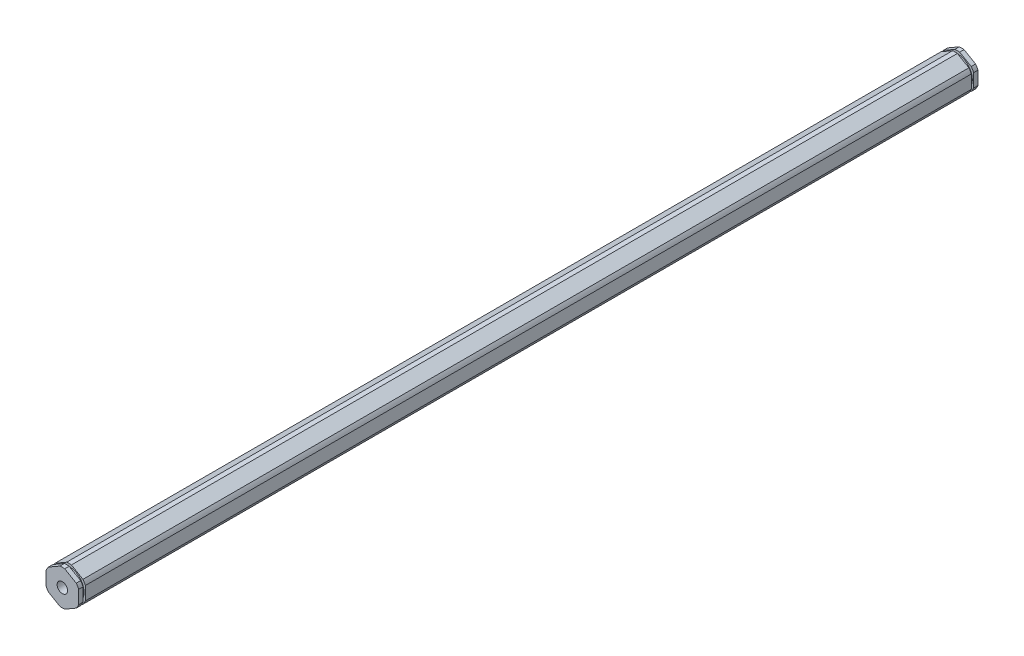
ISO-10303-21;
HEADER;
FILE_DESCRIPTION(('STEP AP214'),'2;1');
FILE_NAME('part.step','',(''),(''),'','','');
FILE_SCHEMA(('AUTOMOTIVE_DESIGN { 1 0 10303 214 1 1 1 1 }'));
ENDSEC;
DATA;
#1=APPLICATION_CONTEXT('core data for automotive mechanical design processes');
#2=APPLICATION_PROTOCOL_DEFINITION('international standard','automotive_design',2000,#1);
#3=PRODUCT_CONTEXT('',#1,'mechanical');
#4=PRODUCT('Part','Part','',(#3));
#5=PRODUCT_RELATED_PRODUCT_CATEGORY('part','',(#4));
#6=PRODUCT_DEFINITION_FORMATION('','',#4);
#7=PRODUCT_DEFINITION_CONTEXT('part definition',#1,'design');
#8=PRODUCT_DEFINITION('design','',#6,#7);
#9=PRODUCT_DEFINITION_SHAPE('','',#8);
#10=(LENGTH_UNIT() NAMED_UNIT(*) SI_UNIT(.MILLI.,.METRE.));
#11=(NAMED_UNIT(*) PLANE_ANGLE_UNIT() SI_UNIT($,.RADIAN.));
#12=(NAMED_UNIT(*) SI_UNIT($,.STERADIAN.) SOLID_ANGLE_UNIT());
#13=UNCERTAINTY_MEASURE_WITH_UNIT(LENGTH_MEASURE(1.E-05),#10,'distance_accuracy_value','');
#14=(GEOMETRIC_REPRESENTATION_CONTEXT(3) GLOBAL_UNCERTAINTY_ASSIGNED_CONTEXT((#13)) GLOBAL_UNIT_ASSIGNED_CONTEXT((#10,
#11,#12)) REPRESENTATION_CONTEXT('',''));
#15=CARTESIAN_POINT('',(0.,0.,0.));
#16=DIRECTION('',(0.,0.,1.));
#17=DIRECTION('',(1.,0.,0.));
#18=AXIS2_PLACEMENT_3D('',#15,#16,#17);
#19=CARTESIAN_POINT('',(0.,0.,174.84725));
#20=DIRECTION('',(0.,0.,-1.));
#21=DIRECTION('',(-1.,0.,0.));
#22=AXIS2_PLACEMENT_3D('',#19,#20,#21);
#23=CYLINDRICAL_SURFACE('',#22,6.858);
#24=CARTESIAN_POINT('',(0.,0.,-172.24375));
#25=DIRECTION('',(0.,0.,1.));
#26=DIRECTION('',(1.,0.,0.));
#27=AXIS2_PLACEMENT_3D('',#24,#25,#26);
#28=CIRCLE('',#27,6.858);
#29=CARTESIAN_POINT('',(5.41826726004728,-4.20411035757861,-172.24375));
#30=VERTEX_POINT('',#29);
#31=CARTESIAN_POINT('',(6.35,-2.59030191290513,-172.24375));
#32=VERTEX_POINT('',#31);
#33=EDGE_CURVE('E308',#30,#32,#28,.T.);
#34=ORIENTED_EDGE('',*,*,#33,.T.);
#35=DIRECTION('',(0.,0.,-1.));
#36=VECTOR('',#35,1.);
#37=CARTESIAN_POINT('',(6.35,-2.59030191290513,174.84725));
#38=LINE('',#37,#36);
#39=CARTESIAN_POINT('',(6.35,-2.59030191290513,172.24375));
#40=VERTEX_POINT('',#39);
#41=EDGE_CURVE('E354',#40,#32,#38,.T.);
#42=ORIENTED_EDGE('',*,*,#41,.F.);
#43=CARTESIAN_POINT('',(0.,0.,172.24375));
#44=DIRECTION('',(0.,0.,1.));
#45=DIRECTION('',(1.,0.,0.));
#46=AXIS2_PLACEMENT_3D('',#43,#44,#45);
#47=CIRCLE('',#46,6.858);
#48=CARTESIAN_POINT('',(5.41826726004727,-4.20411035757862,172.24375));
#49=VERTEX_POINT('',#48);
#50=EDGE_CURVE('E330',#49,#40,#47,.T.);
#51=ORIENTED_EDGE('',*,*,#50,.F.);
#52=DIRECTION('',(0.,0.,-1.));
#53=VECTOR('',#52,1.);
#54=CARTESIAN_POINT('',(5.41826726004727,-4.20411035757862,174.84725));
#55=LINE('',#54,#53);
#56=EDGE_CURVE('E356',#49,#30,#55,.T.);
#57=ORIENTED_EDGE('',*,*,#56,.T.);
#58=EDGE_LOOP('',(#34,#42,#51,#57));
#59=FACE_BOUND('',#58,.T.);
#60=ADVANCED_FACE('F57',(#59),#23,.T.);
#61=CARTESIAN_POINT('',(3.175,-5.49926131403118,174.84725));
#62=DIRECTION('',(-0.5,0.866025403784438,0.));
#63=DIRECTION('',(-0.866025403784439,-0.5,0.));
#64=AXIS2_PLACEMENT_3D('',#61,#62,#63);
#65=PLANE('',#64);
#66=DIRECTION('',(-0.866025403784439,-0.5,0.));
#67=VECTOR('',#66,1.);
#68=CARTESIAN_POINT('',(3.175,-5.49926131403118,-172.24375));
#69=LINE('',#68,#67);
#70=CARTESIAN_POINT('',(0.931732739952731,-6.79441227048375,-172.24375));
#71=VERTEX_POINT('',#70);
#72=EDGE_CURVE('E626',#30,#71,#69,.T.);
#73=ORIENTED_EDGE('',*,*,#72,.F.);
#74=ORIENTED_EDGE('',*,*,#56,.F.);
#75=DIRECTION('',(0.866025403784439,0.5,0.));
#76=VECTOR('',#75,1.);
#77=CARTESIAN_POINT('',(3.175,-5.49926131403118,172.24375));
#78=LINE('',#77,#76);
#79=CARTESIAN_POINT('',(0.931732739952722,-6.79441227048375,172.24375));
#80=VERTEX_POINT('',#79);
#81=EDGE_CURVE('E590',#80,#49,#78,.T.);
#82=ORIENTED_EDGE('',*,*,#81,.F.);
#83=DIRECTION('',(0.,0.,-1.));
#84=VECTOR('',#83,1.);
#85=CARTESIAN_POINT('',(0.931732739952731,-6.79441227048375,174.84725));
#86=LINE('',#85,#84);
#87=EDGE_CURVE('E386',#80,#71,#86,.T.);
#88=ORIENTED_EDGE('',*,*,#87,.T.);
#89=EDGE_LOOP('',(#73,#74,#82,#88));
#90=FACE_BOUND('',#89,.T.);
#91=ADVANCED_FACE('F689',(#90),#65,.F.);
#92=CARTESIAN_POINT('',(-0.931732739952717,-6.79441227048375,-172.24375));
#93=VERTEX_POINT('',#92);
#94=EDGE_CURVE('E358',#93,#71,#28,.T.);
#95=ORIENTED_EDGE('',*,*,#94,.T.);
#96=ORIENTED_EDGE('',*,*,#87,.F.);
#97=CARTESIAN_POINT('',(0.,0.,172.24375));
#98=DIRECTION('',(0.,0.,1.));
#99=DIRECTION('',(1.,0.,0.));
#100=AXIS2_PLACEMENT_3D('',#97,#98,#99);
#101=CIRCLE('',#100,6.858);
#102=CARTESIAN_POINT('',(-0.931732739952721,-6.79441227048375,172.24375));
#103=VERTEX_POINT('',#102);
#104=EDGE_CURVE('E605',#103,#80,#101,.T.);
#105=ORIENTED_EDGE('',*,*,#104,.F.);
#106=DIRECTION('',(0.,0.,-1.));
#107=VECTOR('',#106,1.);
#108=CARTESIAN_POINT('',(-0.931732739952721,-6.79441227048375,174.84725));
#109=LINE('',#108,#107);
#110=EDGE_CURVE('E392',#103,#93,#109,.T.);
#111=ORIENTED_EDGE('',*,*,#110,.T.);
#112=EDGE_LOOP('',(#95,#96,#105,#111));
#113=FACE_BOUND('',#112,.T.);
#114=ADVANCED_FACE('F683',(#113),#23,.T.);
#115=CARTESIAN_POINT('',(-3.175,-5.49926131403118,174.84725));
#116=DIRECTION('',(0.5,0.866025403784439,0.));
#117=DIRECTION('',(-0.866025403784439,0.5,0.));
#118=AXIS2_PLACEMENT_3D('',#115,#116,#117);
#119=PLANE('',#118);
#120=DIRECTION('',(-0.866025403784439,0.5,0.));
#121=VECTOR('',#120,1.);
#122=CARTESIAN_POINT('',(-3.175,-5.49926131403118,-172.24375));
#123=LINE('',#122,#121);
#124=CARTESIAN_POINT('',(-5.41826726004728,-4.20411035757862,-172.24375));
#125=VERTEX_POINT('',#124);
#126=EDGE_CURVE('E629',#93,#125,#123,.T.);
#127=ORIENTED_EDGE('',*,*,#126,.F.);
#128=ORIENTED_EDGE('',*,*,#110,.F.);
#129=DIRECTION('',(0.866025403784439,-0.5,0.));
#130=VECTOR('',#129,1.);
#131=CARTESIAN_POINT('',(-3.175,-5.49926131403118,172.24375));
#132=LINE('',#131,#130);
#133=CARTESIAN_POINT('',(-5.41826726004728,-4.20411035757861,172.24375));
#134=VERTEX_POINT('',#133);
#135=EDGE_CURVE('E587',#134,#103,#132,.T.);
#136=ORIENTED_EDGE('',*,*,#135,.F.);
#137=DIRECTION('',(0.,0.,-1.));
#138=VECTOR('',#137,1.);
#139=CARTESIAN_POINT('',(-5.41826726004728,-4.20411035757862,174.84725));
#140=LINE('',#139,#138);
#141=EDGE_CURVE('E398',#134,#125,#140,.T.);
#142=ORIENTED_EDGE('',*,*,#141,.T.);
#143=EDGE_LOOP('',(#127,#128,#136,#142));
#144=FACE_BOUND('',#143,.T.);
#145=ADVANCED_FACE('F767',(#144),#119,.F.);
#146=CARTESIAN_POINT('',(-6.35,-2.59030191290515,-172.24375));
#147=VERTEX_POINT('',#146);
#148=EDGE_CURVE('E663',#147,#125,#28,.T.);
#149=ORIENTED_EDGE('',*,*,#148,.T.);
#150=ORIENTED_EDGE('',*,*,#141,.F.);
#151=CARTESIAN_POINT('',(-6.35,-2.59030191290514,172.24375));
#152=VERTEX_POINT('',#151);
#153=EDGE_CURVE('E758',#152,#134,#101,.T.);
#154=ORIENTED_EDGE('',*,*,#153,.F.);
#155=DIRECTION('',(0.,0.,-1.));
#156=VECTOR('',#155,1.);
#157=CARTESIAN_POINT('',(-6.35,-2.59030191290514,174.84725));
#158=LINE('',#157,#156);
#159=EDGE_CURVE('E404',#152,#147,#158,.T.);
#160=ORIENTED_EDGE('',*,*,#159,.T.);
#161=EDGE_LOOP('',(#149,#150,#154,#160));
#162=FACE_BOUND('',#161,.T.);
#163=ADVANCED_FACE('F757',(#162),#23,.T.);
#164=CARTESIAN_POINT('',(-6.35,0.,174.84725));
#165=DIRECTION('',(1.,0.,0.));
#166=DIRECTION('',(0.,1.,0.));
#167=AXIS2_PLACEMENT_3D('',#164,#165,#166);
#168=PLANE('',#167);
#169=DIRECTION('',(0.,1.,0.));
#170=VECTOR('',#169,1.);
#171=CARTESIAN_POINT('',(-6.35,0.,-172.24375));
#172=LINE('',#171,#170);
#173=CARTESIAN_POINT('',(-6.35,2.59030191290514,-172.24375));
#174=VERTEX_POINT('',#173);
#175=EDGE_CURVE('E632',#147,#174,#172,.T.);
#176=ORIENTED_EDGE('',*,*,#175,.F.);
#177=ORIENTED_EDGE('',*,*,#159,.F.);
#178=DIRECTION('',(0.,-1.,0.));
#179=VECTOR('',#178,1.);
#180=CARTESIAN_POINT('',(-6.35,0.,172.24375));
#181=LINE('',#180,#179);
#182=CARTESIAN_POINT('',(-6.35,2.59030191290514,172.24375));
#183=VERTEX_POINT('',#182);
#184=EDGE_CURVE('E584',#183,#152,#181,.T.);
#185=ORIENTED_EDGE('',*,*,#184,.F.);
#186=DIRECTION('',(0.,0.,-1.));
#187=VECTOR('',#186,1.);
#188=CARTESIAN_POINT('',(-6.35,2.59030191290514,174.84725));
#189=LINE('',#188,#187);
#190=EDGE_CURVE('E410',#183,#174,#189,.T.);
#191=ORIENTED_EDGE('',*,*,#190,.T.);
#192=EDGE_LOOP('',(#176,#177,#185,#191));
#193=FACE_BOUND('',#192,.T.);
#194=ADVANCED_FACE('F754',(#193),#168,.F.);
#195=CARTESIAN_POINT('',(-5.41826726004727,4.20411035757862,-172.24375));
#196=VERTEX_POINT('',#195);
#197=EDGE_CURVE('E656',#196,#174,#28,.T.);
#198=ORIENTED_EDGE('',*,*,#197,.T.);
#199=ORIENTED_EDGE('',*,*,#190,.F.);
#200=CARTESIAN_POINT('',(-5.41826726004727,4.20411035757862,172.24375));
#201=VERTEX_POINT('',#200);
#202=EDGE_CURVE('E746',#201,#183,#101,.T.);
#203=ORIENTED_EDGE('',*,*,#202,.F.);
#204=DIRECTION('',(0.,0.,-1.));
#205=VECTOR('',#204,1.);
#206=CARTESIAN_POINT('',(-5.41826726004727,4.20411035757862,174.84725));
#207=LINE('',#206,#205);
#208=EDGE_CURVE('E416',#201,#196,#207,.T.);
#209=ORIENTED_EDGE('',*,*,#208,.T.);
#210=EDGE_LOOP('',(#198,#199,#203,#209));
#211=FACE_BOUND('',#210,.T.);
#212=ADVANCED_FACE('F865',(#211),#23,.T.);
#213=CARTESIAN_POINT('',(-3.175,5.49926131403119,174.84725));
#214=DIRECTION('',(0.5,-0.866025403784438,0.));
#215=DIRECTION('',(0.866025403784439,0.5,0.));
#216=AXIS2_PLACEMENT_3D('',#213,#214,#215);
#217=PLANE('',#216);
#218=DIRECTION('',(0.866025403784439,0.5,0.));
#219=VECTOR('',#218,1.);
#220=CARTESIAN_POINT('',(-3.175,5.49926131403119,-172.24375));
#221=LINE('',#220,#219);
#222=CARTESIAN_POINT('',(-0.931732739952731,6.79441227048375,-172.24375));
#223=VERTEX_POINT('',#222);
#224=EDGE_CURVE('E635',#196,#223,#221,.T.);
#225=ORIENTED_EDGE('',*,*,#224,.F.);
#226=ORIENTED_EDGE('',*,*,#208,.F.);
#227=DIRECTION('',(-0.866025403784439,-0.5,0.));
#228=VECTOR('',#227,1.);
#229=CARTESIAN_POINT('',(-3.175,5.49926131403119,172.24375));
#230=LINE('',#229,#228);
#231=CARTESIAN_POINT('',(-0.931732739952728,6.79441227048375,172.24375));
#232=VERTEX_POINT('',#231);
#233=EDGE_CURVE('E581',#232,#201,#230,.T.);
#234=ORIENTED_EDGE('',*,*,#233,.F.);
#235=DIRECTION('',(0.,0.,-1.));
#236=VECTOR('',#235,1.);
#237=CARTESIAN_POINT('',(-0.931732739952731,6.79441227048375,174.84725));
#238=LINE('',#237,#236);
#239=EDGE_CURVE('E422',#232,#223,#238,.T.);
#240=ORIENTED_EDGE('',*,*,#239,.T.);
#241=EDGE_LOOP('',(#225,#226,#234,#240));
#242=FACE_BOUND('',#241,.T.);
#243=ADVANCED_FACE('F740',(#242),#217,.F.);
#244=CARTESIAN_POINT('',(0.931732739952727,6.79441227048375,-172.24375));
#245=VERTEX_POINT('',#244);
#246=EDGE_CURVE('E649',#245,#223,#28,.T.);
#247=ORIENTED_EDGE('',*,*,#246,.T.);
#248=ORIENTED_EDGE('',*,*,#239,.F.);
#249=CARTESIAN_POINT('',(0.931732739952733,6.79441227048375,172.24375));
#250=VERTEX_POINT('',#249);
#251=EDGE_CURVE('E604',#250,#232,#101,.T.);
#252=ORIENTED_EDGE('',*,*,#251,.F.);
#253=DIRECTION('',(0.,0.,-1.));
#254=VECTOR('',#253,1.);
#255=CARTESIAN_POINT('',(0.931732739952733,6.79441227048375,174.84725));
#256=LINE('',#255,#254);
#257=EDGE_CURVE('E426',#250,#245,#256,.T.);
#258=ORIENTED_EDGE('',*,*,#257,.T.);
#259=EDGE_LOOP('',(#247,#248,#252,#258));
#260=FACE_BOUND('',#259,.T.);
#261=ADVANCED_FACE('F743',(#260),#23,.T.);
#262=CARTESIAN_POINT('',(3.175,5.49926131403119,174.84725));
#263=DIRECTION('',(-0.5,-0.866025403784438,0.));
#264=DIRECTION('',(0.866025403784439,-0.5,0.));
#265=AXIS2_PLACEMENT_3D('',#262,#263,#264);
#266=PLANE('',#265);
#267=DIRECTION('',(0.866025403784439,-0.5,0.));
#268=VECTOR('',#267,1.);
#269=CARTESIAN_POINT('',(3.175,5.49926131403119,-172.24375));
#270=LINE('',#269,#268);
#271=CARTESIAN_POINT('',(5.41826726004727,4.20411035757862,-172.24375));
#272=VERTEX_POINT('',#271);
#273=EDGE_CURVE('E638',#245,#272,#270,.T.);
#274=ORIENTED_EDGE('',*,*,#273,.F.);
#275=ORIENTED_EDGE('',*,*,#257,.F.);
#276=DIRECTION('',(-0.866025403784439,0.5,0.));
#277=VECTOR('',#276,1.);
#278=CARTESIAN_POINT('',(3.175,5.49926131403119,172.24375));
#279=LINE('',#278,#277);
#280=CARTESIAN_POINT('',(5.41826726004727,4.20411035757862,172.24375));
#281=VERTEX_POINT('',#280);
#282=EDGE_CURVE('E578',#281,#250,#279,.T.);
#283=ORIENTED_EDGE('',*,*,#282,.F.);
#284=DIRECTION('',(0.,0.,-1.));
#285=VECTOR('',#284,1.);
#286=CARTESIAN_POINT('',(5.41826726004727,4.20411035757862,174.84725));
#287=LINE('',#286,#285);
#288=EDGE_CURVE('E325',#281,#272,#287,.T.);
#289=ORIENTED_EDGE('',*,*,#288,.T.);
#290=EDGE_LOOP('',(#274,#275,#283,#289));
#291=FACE_BOUND('',#290,.T.);
#292=ADVANCED_FACE('F750',(#291),#266,.F.);
#293=CARTESIAN_POINT('',(6.35,2.59030191290513,-172.24375));
#294=VERTEX_POINT('',#293);
#295=EDGE_CURVE('E73',#294,#272,#28,.T.);
#296=ORIENTED_EDGE('',*,*,#295,.T.);
#297=ORIENTED_EDGE('',*,*,#288,.F.);
#298=CARTESIAN_POINT('',(6.35,2.59030191290513,172.24375));
#299=VERTEX_POINT('',#298);
#300=EDGE_CURVE('E601',#299,#281,#101,.T.);
#301=ORIENTED_EDGE('',*,*,#300,.F.);
#302=DIRECTION('',(0.,0.,-1.));
#303=VECTOR('',#302,1.);
#304=CARTESIAN_POINT('',(6.35,2.59030191290513,174.84725));
#305=LINE('',#304,#303);
#306=EDGE_CURVE('E316',#299,#294,#305,.T.);
#307=ORIENTED_EDGE('',*,*,#306,.T.);
#308=EDGE_LOOP('',(#296,#297,#301,#307));
#309=FACE_BOUND('',#308,.T.);
#310=ADVANCED_FACE('F848',(#309),#23,.T.);
#311=CARTESIAN_POINT('',(6.35,0.,174.84725));
#312=DIRECTION('',(-1.,0.,0.));
#313=DIRECTION('',(0.,-1.,0.));
#314=AXIS2_PLACEMENT_3D('',#311,#312,#313);
#315=PLANE('',#314);
#316=DIRECTION('',(0.,-1.,0.));
#317=VECTOR('',#316,1.);
#318=CARTESIAN_POINT('',(6.35,0.,-172.24375));
#319=LINE('',#318,#317);
#320=EDGE_CURVE('E66',#294,#32,#319,.T.);
#321=ORIENTED_EDGE('',*,*,#320,.F.);
#322=ORIENTED_EDGE('',*,*,#306,.F.);
#323=DIRECTION('',(0.,1.,0.));
#324=VECTOR('',#323,1.);
#325=CARTESIAN_POINT('',(6.35,0.,172.24375));
#326=LINE('',#325,#324);
#327=EDGE_CURVE('E361',#40,#299,#326,.T.);
#328=ORIENTED_EDGE('',*,*,#327,.F.);
#329=ORIENTED_EDGE('',*,*,#41,.T.);
#330=EDGE_LOOP('',(#321,#322,#328,#329));
#331=FACE_BOUND('',#330,.T.);
#332=ADVANCED_FACE('F360',(#331),#315,.F.);
#333=DIRECTION('',(0.,-1.,0.));
#334=VECTOR('',#333,1.);
#335=CARTESIAN_POINT('',(6.35,0.,173.13275));
#336=LINE('',#335,#334);
#337=CARTESIAN_POINT('',(6.35,2.59030191290513,173.13275));
#338=VERTEX_POINT('',#337);
#339=CARTESIAN_POINT('',(6.35,-2.59030191290513,173.13275));
#340=VERTEX_POINT('',#339);
#341=EDGE_CURVE('E558',#338,#340,#336,.T.);
#342=ORIENTED_EDGE('',*,*,#341,.F.);
#343=CARTESIAN_POINT('',(6.35,2.59030191290513,174.84725));
#344=VERTEX_POINT('',#343);
#345=EDGE_CURVE('E319',#344,#338,#305,.T.);
#346=ORIENTED_EDGE('',*,*,#345,.F.);
#347=DIRECTION('',(0.,1.,0.));
#348=VECTOR('',#347,1.);
#349=CARTESIAN_POINT('',(6.35,0.,174.84725));
#350=LINE('',#349,#348);
#351=CARTESIAN_POINT('',(6.35,-2.59030191290513,174.84725));
#352=VERTEX_POINT('',#351);
#353=EDGE_CURVE('E501',#352,#344,#350,.T.);
#354=ORIENTED_EDGE('',*,*,#353,.F.);
#355=EDGE_CURVE('E363',#352,#340,#38,.T.);
#356=ORIENTED_EDGE('',*,*,#355,.T.);
#357=EDGE_LOOP('',(#342,#346,#354,#356));
#358=FACE_BOUND('',#357,.T.);
#359=ADVANCED_FACE('F59',(#358),#315,.F.);
#360=CARTESIAN_POINT('',(0.,0.,173.13275));
#361=DIRECTION('',(0.,0.,1.));
#362=DIRECTION('',(1.,0.,0.));
#363=AXIS2_PLACEMENT_3D('',#360,#361,#362);
#364=CIRCLE('',#363,6.858);
#365=CARTESIAN_POINT('',(5.41826726004727,4.20411035757862,173.13275));
#366=VERTEX_POINT('',#365);
#367=EDGE_CURVE('E606',#338,#366,#364,.T.);
#368=ORIENTED_EDGE('',*,*,#367,.T.);
#369=CARTESIAN_POINT('',(5.41826726004727,4.20411035757862,174.84725));
#370=VERTEX_POINT('',#369);
#371=EDGE_CURVE('E317',#370,#366,#287,.T.);
#372=ORIENTED_EDGE('',*,*,#371,.F.);
#373=CARTESIAN_POINT('',(0.,0.,174.84725));
#374=DIRECTION('',(0.,0.,1.));
#375=DIRECTION('',(1.,0.,0.));
#376=AXIS2_PLACEMENT_3D('',#373,#374,#375);
#377=CIRCLE('',#376,6.858);
#378=EDGE_CURVE('E507',#344,#370,#377,.T.);
#379=ORIENTED_EDGE('',*,*,#378,.F.);
#380=ORIENTED_EDGE('',*,*,#345,.T.);
#381=EDGE_LOOP('',(#368,#372,#379,#380));
#382=FACE_BOUND('',#381,.T.);
#383=ADVANCED_FACE('F792',(#382),#23,.T.);
#384=DIRECTION('',(0.866025403784439,-0.5,0.));
#385=VECTOR('',#384,1.);
#386=CARTESIAN_POINT('',(3.175,5.49926131403119,173.13275));
#387=LINE('',#386,#385);
#388=CARTESIAN_POINT('',(0.931732739952733,6.79441227048375,173.13275));
#389=VERTEX_POINT('',#388);
#390=EDGE_CURVE('E561',#389,#366,#387,.T.);
#391=ORIENTED_EDGE('',*,*,#390,.F.);
#392=CARTESIAN_POINT('',(0.931732739952733,6.79441227048375,174.84725));
#393=VERTEX_POINT('',#392);
#394=EDGE_CURVE('E423',#393,#389,#256,.T.);
#395=ORIENTED_EDGE('',*,*,#394,.F.);
#396=DIRECTION('',(-0.866025403784439,0.5,0.));
#397=VECTOR('',#396,1.);
#398=CARTESIAN_POINT('',(3.175,5.49926131403119,174.84725));
#399=LINE('',#398,#397);
#400=EDGE_CURVE('E513',#370,#393,#399,.T.);
#401=ORIENTED_EDGE('',*,*,#400,.F.);
#402=ORIENTED_EDGE('',*,*,#371,.T.);
#403=EDGE_LOOP('',(#391,#395,#401,#402));
#404=FACE_BOUND('',#403,.T.);
#405=ADVANCED_FACE('F800',(#404),#266,.F.);
#406=CARTESIAN_POINT('',(-0.931732739952728,6.79441227048375,173.13275));
#407=VERTEX_POINT('',#406);
#408=EDGE_CURVE('E609',#389,#407,#364,.T.);
#409=ORIENTED_EDGE('',*,*,#408,.T.);
#410=CARTESIAN_POINT('',(-0.931732739952731,6.79441227048375,174.84725));
#411=VERTEX_POINT('',#410);
#412=EDGE_CURVE('E417',#411,#407,#238,.T.);
#413=ORIENTED_EDGE('',*,*,#412,.F.);
#414=EDGE_CURVE('E515',#393,#411,#377,.T.);
#415=ORIENTED_EDGE('',*,*,#414,.F.);
#416=ORIENTED_EDGE('',*,*,#394,.T.);
#417=EDGE_LOOP('',(#409,#413,#415,#416));
#418=FACE_BOUND('',#417,.T.);
#419=ADVANCED_FACE('F806',(#418),#23,.T.);
#420=DIRECTION('',(0.866025403784439,0.5,0.));
#421=VECTOR('',#420,1.);
#422=CARTESIAN_POINT('',(-3.175,5.49926131403119,173.13275));
#423=LINE('',#422,#421);
#424=CARTESIAN_POINT('',(-5.41826726004727,4.20411035757862,173.13275));
#425=VERTEX_POINT('',#424);
#426=EDGE_CURVE('E564',#425,#407,#423,.T.);
#427=ORIENTED_EDGE('',*,*,#426,.F.);
#428=CARTESIAN_POINT('',(-5.41826726004727,4.20411035757862,174.84725));
#429=VERTEX_POINT('',#428);
#430=EDGE_CURVE('E411',#429,#425,#207,.T.);
#431=ORIENTED_EDGE('',*,*,#430,.F.);
#432=DIRECTION('',(-0.866025403784439,-0.5,0.));
#433=VECTOR('',#432,1.);
#434=CARTESIAN_POINT('',(-3.175,5.49926131403119,174.84725));
#435=LINE('',#434,#433);
#436=EDGE_CURVE('E522',#411,#429,#435,.T.);
#437=ORIENTED_EDGE('',*,*,#436,.F.);
#438=ORIENTED_EDGE('',*,*,#412,.T.);
#439=EDGE_LOOP('',(#427,#431,#437,#438));
#440=FACE_BOUND('',#439,.T.);
#441=ADVANCED_FACE('F838',(#440),#217,.F.);
#442=CARTESIAN_POINT('',(-6.35,2.59030191290514,173.13275));
#443=VERTEX_POINT('',#442);
#444=EDGE_CURVE('E1241',#425,#443,#364,.T.);
#445=ORIENTED_EDGE('',*,*,#444,.T.);
#446=CARTESIAN_POINT('',(-6.35,2.59030191290514,174.84725));
#447=VERTEX_POINT('',#446);
#448=EDGE_CURVE('E405',#447,#443,#189,.T.);
#449=ORIENTED_EDGE('',*,*,#448,.F.);
#450=EDGE_CURVE('E525',#429,#447,#377,.T.);
#451=ORIENTED_EDGE('',*,*,#450,.F.);
#452=ORIENTED_EDGE('',*,*,#430,.T.);
#453=EDGE_LOOP('',(#445,#449,#451,#452));
#454=FACE_BOUND('',#453,.T.);
#455=ADVANCED_FACE('F830',(#454),#23,.T.);
#456=DIRECTION('',(0.,1.,0.));
#457=VECTOR('',#456,1.);
#458=CARTESIAN_POINT('',(-6.35,0.,173.13275));
#459=LINE('',#458,#457);
#460=CARTESIAN_POINT('',(-6.35,-2.59030191290514,173.13275));
#461=VERTEX_POINT('',#460);
#462=EDGE_CURVE('E567',#461,#443,#459,.T.);
#463=ORIENTED_EDGE('',*,*,#462,.F.);
#464=CARTESIAN_POINT('',(-6.35,-2.59030191290514,174.84725));
#465=VERTEX_POINT('',#464);
#466=EDGE_CURVE('E399',#465,#461,#158,.T.);
#467=ORIENTED_EDGE('',*,*,#466,.F.);
#468=DIRECTION('',(0.,-1.,0.));
#469=VECTOR('',#468,1.);
#470=CARTESIAN_POINT('',(-6.35,0.,174.84725));
#471=LINE('',#470,#469);
#472=EDGE_CURVE('E526',#447,#465,#471,.T.);
#473=ORIENTED_EDGE('',*,*,#472,.F.);
#474=ORIENTED_EDGE('',*,*,#448,.T.);
#475=EDGE_LOOP('',(#463,#467,#473,#474));
#476=FACE_BOUND('',#475,.T.);
#477=ADVANCED_FACE('F828',(#476),#168,.F.);
#478=CARTESIAN_POINT('',(-5.41826726004728,-4.20411035757861,173.13275));
#479=VERTEX_POINT('',#478);
#480=EDGE_CURVE('E1238',#461,#479,#364,.T.);
#481=ORIENTED_EDGE('',*,*,#480,.T.);
#482=CARTESIAN_POINT('',(-5.41826726004728,-4.20411035757862,174.84725));
#483=VERTEX_POINT('',#482);
#484=EDGE_CURVE('E393',#483,#479,#140,.T.);
#485=ORIENTED_EDGE('',*,*,#484,.F.);
#486=EDGE_CURVE('E529',#465,#483,#377,.T.);
#487=ORIENTED_EDGE('',*,*,#486,.F.);
#488=ORIENTED_EDGE('',*,*,#466,.T.);
#489=EDGE_LOOP('',(#481,#485,#487,#488));
#490=FACE_BOUND('',#489,.T.);
#491=ADVANCED_FACE('F782',(#490),#23,.T.);
#492=DIRECTION('',(-0.866025403784439,0.5,0.));
#493=VECTOR('',#492,1.);
#494=CARTESIAN_POINT('',(-3.175,-5.49926131403118,173.13275));
#495=LINE('',#494,#493);
#496=CARTESIAN_POINT('',(-0.931732739952721,-6.79441227048375,173.13275));
#497=VERTEX_POINT('',#496);
#498=EDGE_CURVE('E570',#497,#479,#495,.T.);
#499=ORIENTED_EDGE('',*,*,#498,.F.);
#500=CARTESIAN_POINT('',(-0.931732739952721,-6.79441227048375,174.84725));
#501=VERTEX_POINT('',#500);
#502=EDGE_CURVE('E387',#501,#497,#109,.T.);
#503=ORIENTED_EDGE('',*,*,#502,.F.);
#504=DIRECTION('',(0.866025403784439,-0.5,0.));
#505=VECTOR('',#504,1.);
#506=CARTESIAN_POINT('',(-3.175,-5.49926131403118,174.84725));
#507=LINE('',#506,#505);
#508=EDGE_CURVE('E530',#483,#501,#507,.T.);
#509=ORIENTED_EDGE('',*,*,#508,.F.);
#510=ORIENTED_EDGE('',*,*,#484,.T.);
#511=EDGE_LOOP('',(#499,#503,#509,#510));
#512=FACE_BOUND('',#511,.T.);
#513=ADVANCED_FACE('F770',(#512),#119,.F.);
#514=CARTESIAN_POINT('',(0.931732739952722,-6.79441227048375,173.13275));
#515=VERTEX_POINT('',#514);
#516=EDGE_CURVE('E610',#497,#515,#364,.T.);
#517=ORIENTED_EDGE('',*,*,#516,.T.);
#518=CARTESIAN_POINT('',(0.931732739952731,-6.79441227048375,174.84725));
#519=VERTEX_POINT('',#518);
#520=EDGE_CURVE('E381',#519,#515,#86,.T.);
#521=ORIENTED_EDGE('',*,*,#520,.F.);
#522=EDGE_CURVE('E533',#501,#519,#377,.T.);
#523=ORIENTED_EDGE('',*,*,#522,.F.);
#524=ORIENTED_EDGE('',*,*,#502,.T.);
#525=EDGE_LOOP('',(#517,#521,#523,#524));
#526=FACE_BOUND('',#525,.T.);
#527=ADVANCED_FACE('F781',(#526),#23,.T.);
#528=DIRECTION('',(-0.866025403784439,-0.5,0.));
#529=VECTOR('',#528,1.);
#530=CARTESIAN_POINT('',(3.175,-5.49926131403118,173.13275));
#531=LINE('',#530,#529);
#532=CARTESIAN_POINT('',(5.41826726004727,-4.20411035757862,173.13275));
#533=VERTEX_POINT('',#532);
#534=EDGE_CURVE('E573',#533,#515,#531,.T.);
#535=ORIENTED_EDGE('',*,*,#534,.F.);
#536=CARTESIAN_POINT('',(5.41826726004727,-4.20411035757862,174.84725));
#537=VERTEX_POINT('',#536);
#538=EDGE_CURVE('E376',#537,#533,#55,.T.);
#539=ORIENTED_EDGE('',*,*,#538,.F.);
#540=DIRECTION('',(0.866025403784439,0.5,0.));
#541=VECTOR('',#540,1.);
#542=CARTESIAN_POINT('',(3.175,-5.49926131403118,174.84725));
#543=LINE('',#542,#541);
#544=EDGE_CURVE('E534',#519,#537,#543,.T.);
#545=ORIENTED_EDGE('',*,*,#544,.F.);
#546=ORIENTED_EDGE('',*,*,#520,.T.);
#547=EDGE_LOOP('',(#535,#539,#545,#546));
#548=FACE_BOUND('',#547,.T.);
#549=ADVANCED_FACE('F791',(#548),#65,.F.);
#550=CARTESIAN_POINT('',(0.,0.,173.13275));
#551=DIRECTION('',(0.,0.,-1.));
#552=DIRECTION('',(-1.,0.,0.));
#553=AXIS2_PLACEMENT_3D('',#550,#551,#552);
#554=CIRCLE('',#553,6.858);
#555=EDGE_CURVE('E336',#340,#533,#554,.T.);
#556=ORIENTED_EDGE('',*,*,#555,.F.);
#557=ORIENTED_EDGE('',*,*,#355,.F.);
#558=EDGE_CURVE('E371',#537,#352,#377,.T.);
#559=ORIENTED_EDGE('',*,*,#558,.F.);
#560=ORIENTED_EDGE('',*,*,#538,.T.);
#561=EDGE_LOOP('',(#556,#557,#559,#560));
#562=FACE_BOUND('',#561,.T.);
#563=ADVANCED_FACE('F801',(#562),#23,.T.);
#564=CARTESIAN_POINT('',(0.,0.,174.84725));
#565=DIRECTION('',(0.,0.,1.));
#566=DIRECTION('',(1.,0.,0.));
#567=AXIS2_PLACEMENT_3D('',#564,#565,#566);
#568=PLANE('',#567);
#569=CARTESIAN_POINT('',(0.,0.,174.84725));
#570=DIRECTION('',(0.,0.,1.));
#571=DIRECTION('',(1.,0.,0.));
#572=AXIS2_PLACEMENT_3D('',#569,#570,#571);
#573=CIRCLE('',#572,2.01929999999999);
#574=CARTESIAN_POINT('',(2.01929999999999,0.,174.84725));
#575=VERTEX_POINT('',#574);
#576=EDGE_CURVE('E552',#575,#575,#573,.T.);
#577=ORIENTED_EDGE('',*,*,#576,.F.);
#578=EDGE_LOOP('',(#577));
#579=FACE_BOUND('',#578,.T.);
#580=ORIENTED_EDGE('',*,*,#353,.T.);
#581=ORIENTED_EDGE('',*,*,#378,.T.);
#582=ORIENTED_EDGE('',*,*,#400,.T.);
#583=ORIENTED_EDGE('',*,*,#414,.T.);
#584=ORIENTED_EDGE('',*,*,#436,.T.);
#585=ORIENTED_EDGE('',*,*,#450,.T.);
#586=ORIENTED_EDGE('',*,*,#472,.T.);
#587=ORIENTED_EDGE('',*,*,#486,.T.);
#588=ORIENTED_EDGE('',*,*,#508,.T.);
#589=ORIENTED_EDGE('',*,*,#522,.T.);
#590=ORIENTED_EDGE('',*,*,#544,.T.);
#591=ORIENTED_EDGE('',*,*,#558,.T.);
#592=EDGE_LOOP('',(#580,#581,#582,#583,#584,#585,#586,#587,#588,#589,#590,#591));
#593=FACE_BOUND('',#592,.T.);
#594=ADVANCED_FACE('F810',(#579,#593),#568,.T.);
#595=CARTESIAN_POINT('',(0.,0.,158.49981));
#596=DIRECTION('',(0.,0.,1.));
#597=DIRECTION('',(1.,0.,0.));
#598=AXIS2_PLACEMENT_3D('',#595,#596,#597);
#599=CONICAL_SURFACE('',#598,2.01929999999999,1.02974425867665);
#600=CARTESIAN_POINT('',(0.,0.,157.286492151998));
#601=VERTEX_POINT('',#600);
#602=VERTEX_LOOP('',#601);
#603=FACE_BOUND('',#602,.T.);
#604=CARTESIAN_POINT('',(0.,0.,158.49981));
#605=DIRECTION('',(0.,0.,1.));
#606=DIRECTION('',(1.,0.,0.));
#607=AXIS2_PLACEMENT_3D('',#604,#605,#606);
#608=CIRCLE('',#607,2.01929999999999);
#609=CARTESIAN_POINT('',(2.01929999999999,0.,158.49981));
#610=VERTEX_POINT('',#609);
#611=EDGE_CURVE('E546',#610,#610,#608,.T.);
#612=ORIENTED_EDGE('',*,*,#611,.T.);
#613=EDGE_LOOP('',(#612));
#614=FACE_BOUND('',#613,.T.);
#615=ADVANCED_FACE('F817',(#603,#614),#599,.F.);
#616=CARTESIAN_POINT('',(0.,0.,174.84725));
#617=DIRECTION('',(0.,0.,1.));
#618=DIRECTION('',(1.,0.,0.));
#619=AXIS2_PLACEMENT_3D('',#616,#617,#618);
#620=CYLINDRICAL_SURFACE('',#619,2.01929999999999);
#621=ORIENTED_EDGE('',*,*,#611,.F.);
#622=EDGE_LOOP('',(#621));
#623=FACE_BOUND('',#622,.T.);
#624=ORIENTED_EDGE('',*,*,#576,.T.);
#625=EDGE_LOOP('',(#624));
#626=FACE_BOUND('',#625,.T.);
#627=ADVANCED_FACE('F1078',(#623,#626),#620,.F.);
#628=CARTESIAN_POINT('',(0.,6.858,173.13275));
#629=DIRECTION('',(0.,0.,-1.));
#630=DIRECTION('',(-1.,0.,0.));
#631=AXIS2_PLACEMENT_3D('',#628,#629,#630);
#632=PLANE('',#631);
#633=CARTESIAN_POINT('',(0.,0.,173.13275));
#634=DIRECTION('',(0.,0.,1.));
#635=DIRECTION('',(1.,0.,0.));
#636=AXIS2_PLACEMENT_3D('',#633,#634,#635);
#637=CIRCLE('',#636,5.8547);
#638=CARTESIAN_POINT('',(5.8547,0.,173.13275));
#639=VERTEX_POINT('',#638);
#640=EDGE_CURVE('E593',#639,#639,#637,.T.);
#641=ORIENTED_EDGE('',*,*,#640,.T.);
#642=EDGE_LOOP('',(#641));
#643=FACE_BOUND('',#642,.T.);
#644=ORIENTED_EDGE('',*,*,#341,.T.);
#645=ORIENTED_EDGE('',*,*,#555,.T.);
#646=ORIENTED_EDGE('',*,*,#534,.T.);
#647=ORIENTED_EDGE('',*,*,#516,.F.);
#648=ORIENTED_EDGE('',*,*,#498,.T.);
#649=ORIENTED_EDGE('',*,*,#480,.F.);
#650=ORIENTED_EDGE('',*,*,#462,.T.);
#651=ORIENTED_EDGE('',*,*,#444,.F.);
#652=ORIENTED_EDGE('',*,*,#426,.T.);
#653=ORIENTED_EDGE('',*,*,#408,.F.);
#654=ORIENTED_EDGE('',*,*,#390,.T.);
#655=ORIENTED_EDGE('',*,*,#367,.F.);
#656=EDGE_LOOP('',(#644,#645,#646,#647,#648,#649,#650,#651,#652,#653,#654,#655));
#657=FACE_BOUND('',#656,.T.);
#658=ADVANCED_FACE('F1069',(#643,#657),#632,.T.);
#659=CARTESIAN_POINT('',(0.,6.858,172.24375));
#660=DIRECTION('',(0.,0.,1.));
#661=DIRECTION('',(1.,0.,0.));
#662=AXIS2_PLACEMENT_3D('',#659,#660,#661);
#663=PLANE('',#662);
#664=CARTESIAN_POINT('',(0.,0.,172.24375));
#665=DIRECTION('',(0.,0.,1.));
#666=DIRECTION('',(1.,0.,0.));
#667=AXIS2_PLACEMENT_3D('',#664,#665,#666);
#668=CIRCLE('',#667,5.8547);
#669=CARTESIAN_POINT('',(5.8547,0.,172.24375));
#670=VERTEX_POINT('',#669);
#671=EDGE_CURVE('E597',#670,#670,#668,.T.);
#672=ORIENTED_EDGE('',*,*,#671,.F.);
#673=EDGE_LOOP('',(#672));
#674=FACE_BOUND('',#673,.T.);
#675=ORIENTED_EDGE('',*,*,#327,.T.);
#676=ORIENTED_EDGE('',*,*,#300,.T.);
#677=ORIENTED_EDGE('',*,*,#282,.T.);
#678=ORIENTED_EDGE('',*,*,#251,.T.);
#679=ORIENTED_EDGE('',*,*,#233,.T.);
#680=ORIENTED_EDGE('',*,*,#202,.T.);
#681=ORIENTED_EDGE('',*,*,#184,.T.);
#682=ORIENTED_EDGE('',*,*,#153,.T.);
#683=ORIENTED_EDGE('',*,*,#135,.T.);
#684=ORIENTED_EDGE('',*,*,#104,.T.);
#685=ORIENTED_EDGE('',*,*,#81,.T.);
#686=ORIENTED_EDGE('',*,*,#50,.T.);
#687=EDGE_LOOP('',(#675,#676,#677,#678,#679,#680,#681,#682,#683,#684,#685,#686));
#688=FACE_BOUND('',#687,.T.);
#689=ADVANCED_FACE('F765',(#674,#688),#663,.T.);
#690=CARTESIAN_POINT('',(0.,0.,175.157387884539));
#691=DIRECTION('',(0.,0.,1.));
#692=DIRECTION('',(1.,0.,0.));
#693=AXIS2_PLACEMENT_3D('',#690,#691,#692);
#694=CYLINDRICAL_SURFACE('',#693,5.8547);
#695=ORIENTED_EDGE('',*,*,#671,.T.);
#696=EDGE_LOOP('',(#695));
#697=FACE_BOUND('',#696,.T.);
#698=ORIENTED_EDGE('',*,*,#640,.F.);
#699=EDGE_LOOP('',(#698));
#700=FACE_BOUND('',#699,.T.);
#701=ADVANCED_FACE('F942',(#697,#700),#694,.T.);
#702=CARTESIAN_POINT('',(0.,6.858,-173.13275));
#703=DIRECTION('',(0.,0.,1.));
#704=DIRECTION('',(-1.,0.,0.));
#705=AXIS2_PLACEMENT_3D('',#702,#703,#704);
#706=PLANE('',#705);
#707=CARTESIAN_POINT('',(0.,0.,-173.13275));
#708=DIRECTION('',(0.,0.,1.));
#709=DIRECTION('',(1.,0.,0.));
#710=AXIS2_PLACEMENT_3D('',#707,#708,#709);
#711=CIRCLE('',#710,5.8547);
#712=CARTESIAN_POINT('',(5.8547,0.,-173.13275));
#713=VERTEX_POINT('',#712);
#714=EDGE_CURVE('E641',#713,#713,#711,.T.);
#715=ORIENTED_EDGE('',*,*,#714,.F.);
#716=EDGE_LOOP('',(#715));
#717=FACE_BOUND('',#716,.T.);
#718=DIRECTION('',(0.866025403784439,0.5,0.));
#719=VECTOR('',#718,1.);
#720=CARTESIAN_POINT('',(3.175,-5.49926131403118,-173.13275));
#721=LINE('',#720,#719);
#722=CARTESIAN_POINT('',(0.931732739952731,-6.79441227048375,-173.13275));
#723=VERTEX_POINT('',#722);
#724=CARTESIAN_POINT('',(5.41826726004728,-4.20411035757861,-173.13275));
#725=VERTEX_POINT('',#724);
#726=EDGE_CURVE('E611',#723,#725,#721,.T.);
#727=ORIENTED_EDGE('',*,*,#726,.T.);
#728=CARTESIAN_POINT('',(0.,0.,-173.13275));
#729=DIRECTION('',(0.,0.,1.));
#730=DIRECTION('',(1.,0.,0.));
#731=AXIS2_PLACEMENT_3D('',#728,#729,#730);
#732=CIRCLE('',#731,6.858);
#733=CARTESIAN_POINT('',(6.35,-2.59030191290513,-173.13275));
#734=VERTEX_POINT('',#733);
#735=EDGE_CURVE('E80',#725,#734,#732,.T.);
#736=ORIENTED_EDGE('',*,*,#735,.T.);
#737=DIRECTION('',(0.,1.,0.));
#738=VECTOR('',#737,1.);
#739=CARTESIAN_POINT('',(6.35,0.,-173.13275));
#740=LINE('',#739,#738);
#741=CARTESIAN_POINT('',(6.35,2.59030191290514,-173.13275));
#742=VERTEX_POINT('',#741);
#743=EDGE_CURVE('E11',#734,#742,#740,.T.);
#744=ORIENTED_EDGE('',*,*,#743,.T.);
#745=CARTESIAN_POINT('',(5.41826726004727,4.20411035757862,-173.13275));
#746=VERTEX_POINT('',#745);
#747=EDGE_CURVE('E295',#742,#746,#732,.T.);
#748=ORIENTED_EDGE('',*,*,#747,.T.);
#749=DIRECTION('',(-0.866025403784439,0.5,0.));
#750=VECTOR('',#749,1.);
#751=CARTESIAN_POINT('',(3.175,5.49926131403119,-173.13275));
#752=LINE('',#751,#750);
#753=CARTESIAN_POINT('',(0.931732739952727,6.79441227048375,-173.13275));
#754=VERTEX_POINT('',#753);
#755=EDGE_CURVE('E623',#746,#754,#752,.T.);
#756=ORIENTED_EDGE('',*,*,#755,.T.);
#757=CARTESIAN_POINT('',(-0.931732739952731,6.79441227048375,-173.13275));
#758=VERTEX_POINT('',#757);
#759=EDGE_CURVE('E309',#754,#758,#732,.T.);
#760=ORIENTED_EDGE('',*,*,#759,.T.);
#761=DIRECTION('',(-0.866025403784439,-0.5,0.));
#762=VECTOR('',#761,1.);
#763=CARTESIAN_POINT('',(-3.175,5.49926131403119,-173.13275));
#764=LINE('',#763,#762);
#765=CARTESIAN_POINT('',(-5.41826726004727,4.20411035757862,-173.13275));
#766=VERTEX_POINT('',#765);
#767=EDGE_CURVE('E620',#758,#766,#764,.T.);
#768=ORIENTED_EDGE('',*,*,#767,.T.);
#769=CARTESIAN_POINT('',(-6.35,2.59030191290514,-173.13275));
#770=VERTEX_POINT('',#769);
#771=EDGE_CURVE('E881',#766,#770,#732,.T.);
#772=ORIENTED_EDGE('',*,*,#771,.T.);
#773=DIRECTION('',(0.,-1.,0.));
#774=VECTOR('',#773,1.);
#775=CARTESIAN_POINT('',(-6.35,0.,-173.13275));
#776=LINE('',#775,#774);
#777=CARTESIAN_POINT('',(-6.35,-2.59030191290515,-173.13275));
#778=VERTEX_POINT('',#777);
#779=EDGE_CURVE('E617',#770,#778,#776,.T.);
#780=ORIENTED_EDGE('',*,*,#779,.T.);
#781=CARTESIAN_POINT('',(-5.41826726004728,-4.20411035757862,-173.13275));
#782=VERTEX_POINT('',#781);
#783=EDGE_CURVE('E703',#778,#782,#732,.T.);
#784=ORIENTED_EDGE('',*,*,#783,.T.);
#785=DIRECTION('',(0.866025403784439,-0.5,0.));
#786=VECTOR('',#785,1.);
#787=CARTESIAN_POINT('',(-3.175,-5.49926131403118,-173.13275));
#788=LINE('',#787,#786);
#789=CARTESIAN_POINT('',(-0.931732739952717,-6.79441227048375,-173.13275));
#790=VERTEX_POINT('',#789);
#791=EDGE_CURVE('E614',#782,#790,#788,.T.);
#792=ORIENTED_EDGE('',*,*,#791,.T.);
#793=EDGE_CURVE('E700',#790,#723,#732,.T.);
#794=ORIENTED_EDGE('',*,*,#793,.T.);
#795=EDGE_LOOP('',(#727,#736,#744,#748,#756,#760,#768,#772,#780,#784,#792,#794));
#796=FACE_BOUND('',#795,.T.);
#797=ADVANCED_FACE('F294',(#717,#796),#706,.T.);
#798=CARTESIAN_POINT('',(0.,6.858,-172.24375));
#799=DIRECTION('',(0.,0.,-1.));
#800=DIRECTION('',(1.,0.,0.));
#801=AXIS2_PLACEMENT_3D('',#798,#799,#800);
#802=PLANE('',#801);
#803=CARTESIAN_POINT('',(0.,0.,-172.24375));
#804=DIRECTION('',(0.,0.,1.));
#805=DIRECTION('',(1.,0.,0.));
#806=AXIS2_PLACEMENT_3D('',#803,#804,#805);
#807=CIRCLE('',#806,5.8547);
#808=CARTESIAN_POINT('',(5.8547,0.,-172.24375));
#809=VERTEX_POINT('',#808);
#810=EDGE_CURVE('E645',#809,#809,#807,.T.);
#811=ORIENTED_EDGE('',*,*,#810,.T.);
#812=EDGE_LOOP('',(#811));
#813=FACE_BOUND('',#812,.T.);
#814=ORIENTED_EDGE('',*,*,#72,.T.);
#815=ORIENTED_EDGE('',*,*,#94,.F.);
#816=ORIENTED_EDGE('',*,*,#126,.T.);
#817=ORIENTED_EDGE('',*,*,#148,.F.);
#818=ORIENTED_EDGE('',*,*,#175,.T.);
#819=ORIENTED_EDGE('',*,*,#197,.F.);
#820=ORIENTED_EDGE('',*,*,#224,.T.);
#821=ORIENTED_EDGE('',*,*,#246,.F.);
#822=ORIENTED_EDGE('',*,*,#273,.T.);
#823=ORIENTED_EDGE('',*,*,#295,.F.);
#824=ORIENTED_EDGE('',*,*,#320,.T.);
#825=ORIENTED_EDGE('',*,*,#33,.F.);
#826=EDGE_LOOP('',(#814,#815,#816,#817,#818,#819,#820,#821,#822,#823,#824,#825));
#827=FACE_BOUND('',#826,.T.);
#828=ADVANCED_FACE('F346',(#813,#827),#802,.T.);
#829=CARTESIAN_POINT('',(0.,0.,-175.157387884539));
#830=DIRECTION('',(0.,0.,-1.));
#831=DIRECTION('',(1.,0.,0.));
#832=AXIS2_PLACEMENT_3D('',#829,#830,#831);
#833=CYLINDRICAL_SURFACE('',#832,5.8547);
#834=ORIENTED_EDGE('',*,*,#810,.F.);
#835=EDGE_LOOP('',(#834));
#836=FACE_BOUND('',#835,.T.);
#837=ORIENTED_EDGE('',*,*,#714,.T.);
#838=EDGE_LOOP('',(#837));
#839=FACE_BOUND('',#838,.T.);
#840=ADVANCED_FACE('F952',(#836,#839),#833,.T.);
#841=CARTESIAN_POINT('',(0.,0.,-158.49981));
#842=DIRECTION('',(0.,0.,-1.));
#843=DIRECTION('',(-1.,0.,0.));
#844=AXIS2_PLACEMENT_3D('',#841,#842,#843);
#845=CONICAL_SURFACE('',#844,2.01929999999999,1.02974425867665);
#846=CARTESIAN_POINT('',(0.,0.,-157.286492151998));
#847=VERTEX_POINT('',#846);
#848=VERTEX_LOOP('',#847);
#849=FACE_BOUND('',#848,.T.);
#850=CARTESIAN_POINT('',(0.,0.,-158.49981));
#851=DIRECTION('',(0.,0.,-1.));
#852=DIRECTION('',(-1.,0.,0.));
#853=AXIS2_PLACEMENT_3D('',#850,#851,#852);
#854=CIRCLE('',#853,2.01929999999999);
#855=CARTESIAN_POINT('',(-2.01929999999999,0.,-158.49981));
#856=VERTEX_POINT('',#855);
#857=EDGE_CURVE('E517',#856,#856,#854,.T.);
#858=ORIENTED_EDGE('',*,*,#857,.T.);
#859=EDGE_LOOP('',(#858));
#860=FACE_BOUND('',#859,.T.);
#861=ADVANCED_FACE('F961',(#849,#860),#845,.F.);
#862=CARTESIAN_POINT('',(0.,0.,-174.84725));
#863=DIRECTION('',(0.,0.,-1.));
#864=DIRECTION('',(-1.,0.,0.));
#865=AXIS2_PLACEMENT_3D('',#862,#863,#864);
#866=CYLINDRICAL_SURFACE('',#865,2.01929999999999);
#867=ORIENTED_EDGE('',*,*,#857,.F.);
#868=EDGE_LOOP('',(#867));
#869=FACE_BOUND('',#868,.T.);
#870=CARTESIAN_POINT('',(0.,0.,-174.84725));
#871=DIRECTION('',(0.,0.,-1.));
#872=DIRECTION('',(-1.,0.,0.));
#873=AXIS2_PLACEMENT_3D('',#870,#871,#872);
#874=CIRCLE('',#873,2.01929999999999);
#875=CARTESIAN_POINT('',(-2.01929999999999,0.,-174.84725));
#876=VERTEX_POINT('',#875);
#877=EDGE_CURVE('E540',#876,#876,#874,.T.);
#878=ORIENTED_EDGE('',*,*,#877,.T.);
#879=EDGE_LOOP('',(#878));
#880=FACE_BOUND('',#879,.T.);
#881=ADVANCED_FACE('F1159',(#869,#880),#866,.F.);
#882=CARTESIAN_POINT('',(0.,0.,-174.84725));
#883=DIRECTION('',(0.,0.,1.));
#884=DIRECTION('',(1.,0.,0.));
#885=AXIS2_PLACEMENT_3D('',#882,#883,#884);
#886=PLANE('',#885);
#887=ORIENTED_EDGE('',*,*,#877,.F.);
#888=EDGE_LOOP('',(#887));
#889=FACE_BOUND('',#888,.T.);
#890=DIRECTION('',(0.,1.,0.));
#891=VECTOR('',#890,1.);
#892=CARTESIAN_POINT('',(6.35,0.,-174.84725));
#893=LINE('',#892,#891);
#894=CARTESIAN_POINT('',(6.35,-2.59030191290513,-174.84725));
#895=VERTEX_POINT('',#894);
#896=CARTESIAN_POINT('',(6.35,2.59030191290513,-174.84725));
#897=VERTEX_POINT('',#896);
#898=EDGE_CURVE('E314',#895,#897,#893,.T.);
#899=ORIENTED_EDGE('',*,*,#898,.F.);
#900=CARTESIAN_POINT('',(0.,0.,-174.84725));
#901=DIRECTION('',(0.,0.,1.));
#902=DIRECTION('',(1.,0.,0.));
#903=AXIS2_PLACEMENT_3D('',#900,#901,#902);
#904=CIRCLE('',#903,6.858);
#905=CARTESIAN_POINT('',(5.41826726004727,-4.20411035757862,-174.84725));
#906=VERTEX_POINT('',#905);
#907=EDGE_CURVE('E467',#906,#895,#904,.T.);
#908=ORIENTED_EDGE('',*,*,#907,.F.);
#909=DIRECTION('',(0.866025403784439,0.5,0.));
#910=VECTOR('',#909,1.);
#911=CARTESIAN_POINT('',(3.175,-5.49926131403118,-174.84725));
#912=LINE('',#911,#910);
#913=CARTESIAN_POINT('',(0.931732739952731,-6.79441227048375,-174.84725));
#914=VERTEX_POINT('',#913);
#915=EDGE_CURVE('E374',#914,#906,#912,.T.);
#916=ORIENTED_EDGE('',*,*,#915,.F.);
#917=CARTESIAN_POINT('',(-0.931732739952721,-6.79441227048375,-174.84725));
#918=VERTEX_POINT('',#917);
#919=EDGE_CURVE('E482',#918,#914,#904,.T.);
#920=ORIENTED_EDGE('',*,*,#919,.F.);
#921=DIRECTION('',(0.866025403784439,-0.5,0.));
#922=VECTOR('',#921,1.);
#923=CARTESIAN_POINT('',(-3.175,-5.49926131403118,-174.84725));
#924=LINE('',#923,#922);
#925=CARTESIAN_POINT('',(-5.41826726004728,-4.20411035757862,-174.84725));
#926=VERTEX_POINT('',#925);
#927=EDGE_CURVE('E481',#926,#918,#924,.T.);
#928=ORIENTED_EDGE('',*,*,#927,.F.);
#929=CARTESIAN_POINT('',(-6.35,-2.59030191290514,-174.84725));
#930=VERTEX_POINT('',#929);
#931=EDGE_CURVE('E471',#930,#926,#904,.T.);
#932=ORIENTED_EDGE('',*,*,#931,.F.);
#933=DIRECTION('',(0.,-1.,0.));
#934=VECTOR('',#933,1.);
#935=CARTESIAN_POINT('',(-6.35,0.,-174.84725));
#936=LINE('',#935,#934);
#937=CARTESIAN_POINT('',(-6.35,2.59030191290514,-174.84725));
#938=VERTEX_POINT('',#937);
#939=EDGE_CURVE('E470',#938,#930,#936,.T.);
#940=ORIENTED_EDGE('',*,*,#939,.F.);
#941=CARTESIAN_POINT('',(-5.41826726004727,4.20411035757862,-174.84725));
#942=VERTEX_POINT('',#941);
#943=EDGE_CURVE('E461',#942,#938,#904,.T.);
#944=ORIENTED_EDGE('',*,*,#943,.F.);
#945=DIRECTION('',(-0.866025403784439,-0.5,0.));
#946=VECTOR('',#945,1.);
#947=CARTESIAN_POINT('',(-3.175,5.49926131403119,-174.84725));
#948=LINE('',#947,#946);
#949=CARTESIAN_POINT('',(-0.931732739952731,6.79441227048375,-174.84725));
#950=VERTEX_POINT('',#949);
#951=EDGE_CURVE('E458',#950,#942,#948,.T.);
#952=ORIENTED_EDGE('',*,*,#951,.F.);
#953=CARTESIAN_POINT('',(0.931732739952733,6.79441227048375,-174.84725));
#954=VERTEX_POINT('',#953);
#955=EDGE_CURVE('E445',#954,#950,#904,.T.);
#956=ORIENTED_EDGE('',*,*,#955,.F.);
#957=DIRECTION('',(-0.866025403784439,0.5,0.));
#958=VECTOR('',#957,1.);
#959=CARTESIAN_POINT('',(3.175,5.49926131403119,-174.84725));
#960=LINE('',#959,#958);
#961=CARTESIAN_POINT('',(5.41826726004727,4.20411035757862,-174.84725));
#962=VERTEX_POINT('',#961);
#963=EDGE_CURVE('E449',#962,#954,#960,.T.);
#964=ORIENTED_EDGE('',*,*,#963,.F.);
#965=EDGE_CURVE('E453',#897,#962,#904,.T.);
#966=ORIENTED_EDGE('',*,*,#965,.F.);
#967=EDGE_LOOP('',(#899,#908,#916,#920,#928,#932,#940,#944,#952,#956,#964,#966));
#968=FACE_BOUND('',#967,.T.);
#969=ADVANCED_FACE('F455',(#889,#968),#886,.F.);
#970=ORIENTED_EDGE('',*,*,#743,.F.);
#971=EDGE_CURVE('E364',#734,#895,#38,.T.);
#972=ORIENTED_EDGE('',*,*,#971,.T.);
#973=ORIENTED_EDGE('',*,*,#898,.T.);
#974=EDGE_CURVE('E304',#742,#897,#305,.T.);
#975=ORIENTED_EDGE('',*,*,#974,.F.);
#976=EDGE_LOOP('',(#970,#972,#973,#975));
#977=FACE_BOUND('',#976,.T.);
#978=ADVANCED_FACE('F312',(#977),#315,.F.);
#979=ORIENTED_EDGE('',*,*,#747,.F.);
#980=ORIENTED_EDGE('',*,*,#974,.T.);
#981=ORIENTED_EDGE('',*,*,#965,.T.);
#982=EDGE_CURVE('E306',#746,#962,#287,.T.);
#983=ORIENTED_EDGE('',*,*,#982,.F.);
#984=EDGE_LOOP('',(#979,#980,#981,#983));
#985=FACE_BOUND('',#984,.T.);
#986=ADVANCED_FACE('F302',(#985),#23,.T.);
#987=ORIENTED_EDGE('',*,*,#755,.F.);
#988=ORIENTED_EDGE('',*,*,#982,.T.);
#989=ORIENTED_EDGE('',*,*,#963,.T.);
#990=EDGE_CURVE('E421',#754,#954,#256,.T.);
#991=ORIENTED_EDGE('',*,*,#990,.F.);
#992=EDGE_LOOP('',(#987,#988,#989,#991));
#993=FACE_BOUND('',#992,.T.);
#994=ADVANCED_FACE('F450',(#993),#266,.F.);
#995=ORIENTED_EDGE('',*,*,#759,.F.);
#996=ORIENTED_EDGE('',*,*,#990,.T.);
#997=ORIENTED_EDGE('',*,*,#955,.T.);
#998=EDGE_CURVE('E415',#758,#950,#238,.T.);
#999=ORIENTED_EDGE('',*,*,#998,.F.);
#1000=EDGE_LOOP('',(#995,#996,#997,#999));
#1001=FACE_BOUND('',#1000,.T.);
#1002=ADVANCED_FACE('F442',(#1001),#23,.T.);
#1003=ORIENTED_EDGE('',*,*,#767,.F.);
#1004=ORIENTED_EDGE('',*,*,#998,.T.);
#1005=ORIENTED_EDGE('',*,*,#951,.T.);
#1006=EDGE_CURVE('E409',#766,#942,#207,.T.);
#1007=ORIENTED_EDGE('',*,*,#1006,.F.);
#1008=EDGE_LOOP('',(#1003,#1004,#1005,#1007));
#1009=FACE_BOUND('',#1008,.T.);
#1010=ADVANCED_FACE('F845',(#1009),#217,.F.);
#1011=ORIENTED_EDGE('',*,*,#771,.F.);
#1012=ORIENTED_EDGE('',*,*,#1006,.T.);
#1013=ORIENTED_EDGE('',*,*,#943,.T.);
#1014=EDGE_CURVE('E403',#770,#938,#189,.T.);
#1015=ORIENTED_EDGE('',*,*,#1014,.F.);
#1016=EDGE_LOOP('',(#1011,#1012,#1013,#1015));
#1017=FACE_BOUND('',#1016,.T.);
#1018=ADVANCED_FACE('F776',(#1017),#23,.T.);
#1019=ORIENTED_EDGE('',*,*,#779,.F.);
#1020=ORIENTED_EDGE('',*,*,#1014,.T.);
#1021=ORIENTED_EDGE('',*,*,#939,.T.);
#1022=EDGE_CURVE('E397',#778,#930,#158,.T.);
#1023=ORIENTED_EDGE('',*,*,#1022,.F.);
#1024=EDGE_LOOP('',(#1019,#1020,#1021,#1023));
#1025=FACE_BOUND('',#1024,.T.);
#1026=ADVANCED_FACE('F835',(#1025),#168,.F.);
#1027=ORIENTED_EDGE('',*,*,#783,.F.);
#1028=ORIENTED_EDGE('',*,*,#1022,.T.);
#1029=ORIENTED_EDGE('',*,*,#931,.T.);
#1030=EDGE_CURVE('E391',#782,#926,#140,.T.);
#1031=ORIENTED_EDGE('',*,*,#1030,.F.);
#1032=EDGE_LOOP('',(#1027,#1028,#1029,#1031));
#1033=FACE_BOUND('',#1032,.T.);
#1034=ADVANCED_FACE('F777',(#1033),#23,.T.);
#1035=ORIENTED_EDGE('',*,*,#791,.F.);
#1036=ORIENTED_EDGE('',*,*,#1030,.T.);
#1037=ORIENTED_EDGE('',*,*,#927,.T.);
#1038=EDGE_CURVE('E385',#790,#918,#109,.T.);
#1039=ORIENTED_EDGE('',*,*,#1038,.F.);
#1040=EDGE_LOOP('',(#1035,#1036,#1037,#1039));
#1041=FACE_BOUND('',#1040,.T.);
#1042=ADVANCED_FACE('F706',(#1041),#119,.F.);
#1043=ORIENTED_EDGE('',*,*,#793,.F.);
#1044=ORIENTED_EDGE('',*,*,#1038,.T.);
#1045=ORIENTED_EDGE('',*,*,#919,.T.);
#1046=EDGE_CURVE('E380',#723,#914,#86,.T.);
#1047=ORIENTED_EDGE('',*,*,#1046,.F.);
#1048=EDGE_LOOP('',(#1043,#1044,#1045,#1047));
#1049=FACE_BOUND('',#1048,.T.);
#1050=ADVANCED_FACE('F699',(#1049),#23,.T.);
#1051=ORIENTED_EDGE('',*,*,#726,.F.);
#1052=ORIENTED_EDGE('',*,*,#1046,.T.);
#1053=ORIENTED_EDGE('',*,*,#915,.T.);
#1054=EDGE_CURVE('E370',#725,#906,#55,.T.);
#1055=ORIENTED_EDGE('',*,*,#1054,.F.);
#1056=EDGE_LOOP('',(#1051,#1052,#1053,#1055));
#1057=FACE_BOUND('',#1056,.T.);
#1058=ADVANCED_FACE('F696',(#1057),#65,.F.);
#1059=ORIENTED_EDGE('',*,*,#735,.F.);
#1060=ORIENTED_EDGE('',*,*,#1054,.T.);
#1061=ORIENTED_EDGE('',*,*,#907,.T.);
#1062=ORIENTED_EDGE('',*,*,#971,.F.);
#1063=EDGE_LOOP('',(#1059,#1060,#1061,#1062));
#1064=FACE_BOUND('',#1063,.T.);
#1065=ADVANCED_FACE('F786',(#1064),#23,.T.);
#1066=CLOSED_SHELL('',(#60,#91,#114,#145,#163,#194,#212,#243,#261,#292,#310,#332,#359,#383,#405,
#419,#441,#455,#477,#491,#513,#527,#549,#563,#594,#615,#627,#658,#689,#701,#797,#828,#840,#861,
#881,#969,#978,#986,#994,#1002,#1010,#1018,#1026,#1034,#1042,#1050,#1058,#1065));
#1067=MANIFOLD_SOLID_BREP('B2',#1066);
#1068=ADVANCED_BREP_SHAPE_REPRESENTATION('',(#18,#1067),#14);
#1069=SHAPE_DEFINITION_REPRESENTATION(#9,#1068);
ENDSEC;
END-ISO-10303-21;
